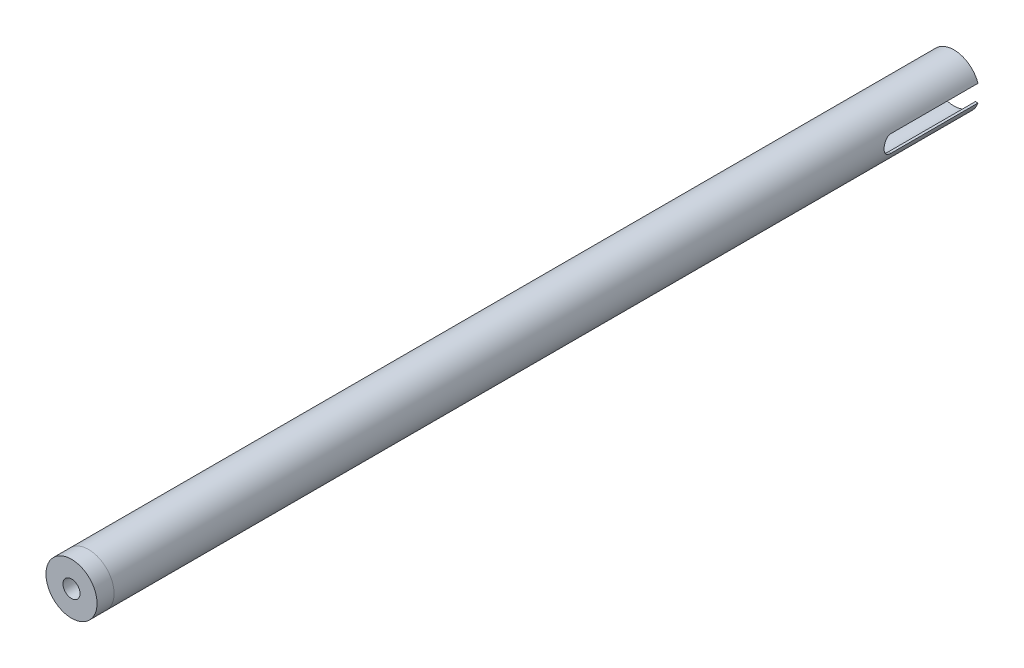
ISO-10303-21;
HEADER;
FILE_DESCRIPTION(('STEP AP214'),'2;1');
FILE_NAME('part.step','',(''),(''),'','','');
FILE_SCHEMA(('AUTOMOTIVE_DESIGN { 1 0 10303 214 1 1 1 1 }'));
ENDSEC;
DATA;
#1=APPLICATION_CONTEXT('core data for automotive mechanical design processes');
#2=APPLICATION_PROTOCOL_DEFINITION('international standard','automotive_design',2000,#1);
#3=PRODUCT_CONTEXT('',#1,'mechanical');
#4=PRODUCT('Part','Part','',(#3));
#5=PRODUCT_RELATED_PRODUCT_CATEGORY('part','',(#4));
#6=PRODUCT_DEFINITION_FORMATION('','',#4);
#7=PRODUCT_DEFINITION_CONTEXT('part definition',#1,'design');
#8=PRODUCT_DEFINITION('design','',#6,#7);
#9=PRODUCT_DEFINITION_SHAPE('','',#8);
#10=(LENGTH_UNIT() NAMED_UNIT(*) SI_UNIT(.MILLI.,.METRE.));
#11=(NAMED_UNIT(*) PLANE_ANGLE_UNIT() SI_UNIT($,.RADIAN.));
#12=(NAMED_UNIT(*) SI_UNIT($,.STERADIAN.) SOLID_ANGLE_UNIT());
#13=UNCERTAINTY_MEASURE_WITH_UNIT(LENGTH_MEASURE(1.E-05),#10,'distance_accuracy_value','');
#14=(GEOMETRIC_REPRESENTATION_CONTEXT(3) GLOBAL_UNCERTAINTY_ASSIGNED_CONTEXT((#13)) GLOBAL_UNIT_ASSIGNED_CONTEXT((#10,
#11,#12)) REPRESENTATION_CONTEXT('',''));
#15=CARTESIAN_POINT('',(0.,0.,0.));
#16=DIRECTION('',(0.,0.,1.));
#17=DIRECTION('',(1.,0.,0.));
#18=AXIS2_PLACEMENT_3D('',#15,#16,#17);
#19=CARTESIAN_POINT('',(0.,0.,-329.057104319801));
#20=DIRECTION('',(0.,0.,1.));
#21=DIRECTION('',(1.,0.,0.));
#22=AXIS2_PLACEMENT_3D('',#19,#20,#21);
#23=CYLINDRICAL_SURFACE('',#22,9.525);
#24=CARTESIAN_POINT('',(0.,0.,-6.35));
#25=DIRECTION('',(0.,0.,1.));
#26=DIRECTION('',(1.,0.,0.));
#27=AXIS2_PLACEMENT_3D('',#24,#25,#26);
#28=CIRCLE('',#27,9.525);
#29=CARTESIAN_POINT('',(9.525,0.,-6.35));
#30=VERTEX_POINT('',#29);
#31=EDGE_CURVE('E165',#30,#30,#28,.T.);
#32=ORIENTED_EDGE('',*,*,#31,.F.);
#33=EDGE_LOOP('',(#32));
#34=FACE_BOUND('',#33,.T.);
#35=CARTESIAN_POINT('',(-8.98025612106915,3.175,-296.672104319801));
#36=CARTESIAN_POINT('',(-8.98024230233901,3.17501142134308,-296.585478216465));
#37=CARTESIAN_POINT('',(-8.98150922759707,3.17145501317748,-296.498859833989));
#38=CARTESIAN_POINT('',(-8.98650170400112,3.1572955094353,-296.326295019163));
#39=CARTESIAN_POINT('',(-8.99022659113085,3.14669431699565,-296.240348411677));
#40=CARTESIAN_POINT('',(-9.00001740508998,3.11857670914846,-296.069994170512));
#41=CARTESIAN_POINT('',(-9.00607621805003,3.10108130380329,-295.985582668705));
#42=CARTESIAN_POINT('',(-9.02033586435303,3.05935434973544,-295.81864786737));
#43=CARTESIAN_POINT('',(-9.02853677497232,3.03512255799513,-295.736124636078));
#44=CARTESIAN_POINT('',(-9.05598792154067,2.95264369348964,-295.492326012802));
#45=CARTESIAN_POINT('',(-9.07810200713863,2.88457148458963,-295.334572428477));
#46=CARTESIAN_POINT('',(-9.12745136023601,2.72437908867645,-295.032695909988));
#47=CARTESIAN_POINT('',(-9.15468995097455,2.63224328129308,-294.88858191276));
#48=CARTESIAN_POINT('',(-9.21240416673121,2.42269155952414,-294.612429052936));
#49=CARTESIAN_POINT('',(-9.24296008478943,2.30449853156512,-294.480995471073));
#50=CARTESIAN_POINT('',(-9.30318902123142,2.04784031127145,-294.239400174736));
#51=CARTESIAN_POINT('',(-9.33286185998227,1.90937102786996,-294.129242763504));
#52=CARTESIAN_POINT('',(-9.38892492365178,1.61159672697579,-293.930525752016));
#53=CARTESIAN_POINT('',(-9.41520772598947,1.45183792838571,-293.842613566006));
#54=CARTESIAN_POINT('',(-9.46054712430069,1.11883883316163,-293.695208839936));
#55=CARTESIAN_POINT('',(-9.47961052807859,0.945611424033776,-293.635689511935));
#56=CARTESIAN_POINT('',(-9.50410661247238,0.642992499572378,-293.560210747439));
#57=CARTESIAN_POINT('',(-9.51189798251809,0.515662964136021,-293.536592775396));
#58=CARTESIAN_POINT('',(-9.51973491912187,0.323120458247706,-293.512926509222));
#59=CARTESIAN_POINT('',(-9.52170555244691,0.258670486244995,-293.506997861606));
#60=CARTESIAN_POINT('',(-9.52433958502699,0.129484930346662,-293.499085236939));
#61=CARTESIAN_POINT('',(-9.5250026318504,0.0647492741617735,-293.497102323375));
#62=CARTESIAN_POINT('',(-9.525,0.,-293.497104319801));
#63=B_SPLINE_CURVE_WITH_KNOTS('',3,(#35,#36,#37,#38,#39,#40,#41,#42,#43,#44,#45,#46,#47,#48,#49,
#50,#51,#52,#53,#54,#55,#56,#57,#58,#59,#60,#61,#62),.UNSPECIFIED.,.F.,.F.,(4,2,2,2,2,2,2,2,2,2,
2,2,2,4),(0.,0.259783027985017,0.519495904525387,0.77842335407941,1.0373601457496,
1.5544837070914,2.07194378605916,2.60765740005749,3.14347925237348,3.69345572792675,
4.24291228331228,4.63105001394513,4.82518498412947,5.01937227204625),.UNSPECIFIED.);
#64=CARTESIAN_POINT('',(-8.98025612106915,3.175,-296.672104319801));
#65=VERTEX_POINT('',#64);
#66=CARTESIAN_POINT('',(-9.525,0.,-293.497104319801));
#67=VERTEX_POINT('',#66);
#68=EDGE_CURVE('E192',#65,#67,#63,.T.);
#69=ORIENTED_EDGE('',*,*,#68,.T.);
#70=CARTESIAN_POINT('',(-9.525,0.,-293.497104319801));
#71=CARTESIAN_POINT('',(-9.52501110102584,-0.0867614879611047,-293.497093214763));
#72=CARTESIAN_POINT('',(-9.52381482114642,-0.173516026970688,-293.50066042642));
#73=CARTESIAN_POINT('',(-9.51909010104991,-0.346361025979108,-293.514865265002));
#74=CARTESIAN_POINT('',(-9.51556219632442,-0.432451633867625,-293.525501268479));
#75=CARTESIAN_POINT('',(-9.50626969526085,-0.603121388983429,-293.553718259993));
#76=CARTESIAN_POINT('',(-9.50051134567603,-0.687704073408636,-293.571279854162));
#77=CARTESIAN_POINT('',(-9.48692170416637,-0.854983898510564,-293.6131711748));
#78=CARTESIAN_POINT('',(-9.47909035815865,-0.937680989932468,-293.63750107785));
#79=CARTESIAN_POINT('',(-9.45278540829331,-1.18202731628102,-293.720335470788));
#80=CARTESIAN_POINT('',(-9.43148823554423,-1.3401498669332,-293.788721152133));
#81=CARTESIAN_POINT('',(-9.38354405256208,-1.64264414222568,-293.949647677909));
#82=CARTESIAN_POINT('',(-9.35689419571071,-1.78700848960572,-294.042201383063));
#83=CARTESIAN_POINT('',(-9.30002401422068,-2.06291632995426,-294.252194811268));
#84=CARTESIAN_POINT('',(-9.26971861159364,-2.19392359690272,-294.370317096687));
#85=CARTESIAN_POINT('',(-9.20941732427213,-2.43468689521897,-294.626655073522));
#86=CARTESIAN_POINT('',(-9.1794215361322,-2.54443647619592,-294.764876841681));
#87=CARTESIAN_POINT('',(-9.122187697517,-2.74268087840456,-295.062384820728));
#88=CARTESIAN_POINT('',(-9.09505529775998,-2.83046425019683,-295.222166958801));
#89=CARTESIAN_POINT('',(-9.04794936227173,-2.97762337182932,-295.555211280807));
#90=CARTESIAN_POINT('',(-9.0279682579705,-3.03702917747986,-295.728458975614));
#91=CARTESIAN_POINT('',(-9.00226999890487,-3.1122125650425,-296.030746009609));
#92=CARTESIAN_POINT('',(-8.99408207355733,-3.13569679171672,-296.157708331036));
#93=CARTESIAN_POINT('',(-8.98304472933549,-3.16711304593222,-296.413785502805));
#94=CARTESIAN_POINT('',(-8.98019613476149,-3.17504267212105,-296.542900682407));
#95=CARTESIAN_POINT('',(-8.98025612106915,-3.175,-296.672104319801));
#96=B_SPLINE_CURVE_WITH_KNOTS('',3,(#70,#71,#72,#73,#74,#75,#76,#77,#78,#79,#80,#81,#82,#83,#84,
#85,#86,#87,#88,#89,#90,#91,#92,#93,#94,#95),.UNSPECIFIED.,.F.,.F.,(4,2,2,2,2,2,2,2,2,2,2,2,4),
(0.,0.260191091827307,0.52032244773723,0.779730467212497,1.03914525511038,1.55731822615721,
2.07576750062865,2.61028978360817,3.14497400776474,3.69521752133766,4.24487695078963,
4.63199348452988,5.01916977744542),.UNSPECIFIED.);
#97=CARTESIAN_POINT('',(-8.98025612106916,-3.175,-296.672104319801));
#98=VERTEX_POINT('',#97);
#99=EDGE_CURVE('E144',#67,#98,#96,.T.);
#100=ORIENTED_EDGE('',*,*,#99,.T.);
#101=DIRECTION('',(0.,0.,-1.));
#102=VECTOR('',#101,1.);
#103=CARTESIAN_POINT('',(-8.98025612106916,-3.175,-293.497104319801));
#104=LINE('',#103,#102);
#105=CARTESIAN_POINT('',(-8.98025612106916,-3.175,-329.057104319801));
#106=VERTEX_POINT('',#105);
#107=EDGE_CURVE('E139',#98,#106,#104,.T.);
#108=ORIENTED_EDGE('',*,*,#107,.T.);
#109=CARTESIAN_POINT('',(0.,0.,-329.057104319801));
#110=DIRECTION('',(0.,0.,1.));
#111=DIRECTION('',(1.,0.,0.));
#112=AXIS2_PLACEMENT_3D('',#109,#110,#111);
#113=CIRCLE('',#112,9.525);
#114=CARTESIAN_POINT('',(8.98025612106915,-3.175,-329.057104319801));
#115=VERTEX_POINT('',#114);
#116=EDGE_CURVE('E142',#106,#115,#113,.T.);
#117=ORIENTED_EDGE('',*,*,#116,.T.);
#118=DIRECTION('',(0.,0.,-1.));
#119=VECTOR('',#118,1.);
#120=CARTESIAN_POINT('',(8.98025612106915,-3.175,-293.497104319801));
#121=LINE('',#120,#119);
#122=CARTESIAN_POINT('',(8.98025612106915,-3.175,-296.672104319801));
#123=VERTEX_POINT('',#122);
#124=EDGE_CURVE('E425',#123,#115,#121,.T.);
#125=ORIENTED_EDGE('',*,*,#124,.F.);
#126=CARTESIAN_POINT('',(8.98025612106915,-3.175,-296.672104319801));
#127=CARTESIAN_POINT('',(8.98024230233901,-3.17501142134308,-296.585478216465));
#128=CARTESIAN_POINT('',(8.98150922759707,-3.17145501317748,-296.498859833989));
#129=CARTESIAN_POINT('',(8.98650170400112,-3.1572955094353,-296.326295019163));
#130=CARTESIAN_POINT('',(8.99022659113085,-3.14669431699565,-296.240348411677));
#131=CARTESIAN_POINT('',(9.00001740508998,-3.11857670914846,-296.069994170512));
#132=CARTESIAN_POINT('',(9.00607621805003,-3.10108130380329,-295.985582668705));
#133=CARTESIAN_POINT('',(9.02033586435303,-3.05935434973544,-295.81864786737));
#134=CARTESIAN_POINT('',(9.02853677497232,-3.03512255799513,-295.736124636078));
#135=CARTESIAN_POINT('',(9.05598792154067,-2.95264369348964,-295.492326012802));
#136=CARTESIAN_POINT('',(9.07810200713863,-2.88457148458963,-295.334572428477));
#137=CARTESIAN_POINT('',(9.12745136023601,-2.72437908867645,-295.032695909988));
#138=CARTESIAN_POINT('',(9.15468995097455,-2.63224328129308,-294.88858191276));
#139=CARTESIAN_POINT('',(9.21240416673121,-2.42269155952414,-294.612429052936));
#140=CARTESIAN_POINT('',(9.24296008478943,-2.30449853156512,-294.480995471073));
#141=CARTESIAN_POINT('',(9.30318902123142,-2.04784031127145,-294.239400174736));
#142=CARTESIAN_POINT('',(9.33286185998227,-1.90937102786996,-294.129242763504));
#143=CARTESIAN_POINT('',(9.38892492365178,-1.61159672697579,-293.930525752016));
#144=CARTESIAN_POINT('',(9.41520772598947,-1.45183792838571,-293.842613566006));
#145=CARTESIAN_POINT('',(9.46054712430069,-1.11883883316163,-293.695208839936));
#146=CARTESIAN_POINT('',(9.47961052807859,-0.945611424033776,-293.635689511935));
#147=CARTESIAN_POINT('',(9.50410661247238,-0.642992499572378,-293.560210747439));
#148=CARTESIAN_POINT('',(9.51189798251809,-0.515662964136021,-293.536592775396));
#149=CARTESIAN_POINT('',(9.51973491912187,-0.323120458247706,-293.512926509222));
#150=CARTESIAN_POINT('',(9.52170555244691,-0.258670486244995,-293.506997861606));
#151=CARTESIAN_POINT('',(9.52433958502699,-0.129484930346662,-293.499085236939));
#152=CARTESIAN_POINT('',(9.5250026318504,-0.0647492741617735,-293.497102323375));
#153=CARTESIAN_POINT('',(9.525,0.,-293.497104319801));
#154=B_SPLINE_CURVE_WITH_KNOTS('',3,(#126,#127,#128,#129,#130,#131,#132,#133,#134,#135,#136,
#137,#138,#139,#140,#141,#142,#143,#144,#145,#146,#147,#148,#149,#150,#151,#152,#153),
.UNSPECIFIED.,.F.,.F.,(4,2,2,2,2,2,2,2,2,2,2,2,2,4),(0.,0.259783027985017,0.519495904525387,
0.77842335407941,1.0373601457496,1.5544837070914,2.07194378605916,2.60765740005749,
3.14347925237348,3.69345572792675,4.24291228331228,4.63105001394513,4.82518498412947,
5.01937227204625),.UNSPECIFIED.);
#155=CARTESIAN_POINT('',(9.525,0.,-293.497104319801));
#156=VERTEX_POINT('',#155);
#157=EDGE_CURVE('E85',#123,#156,#154,.T.);
#158=ORIENTED_EDGE('',*,*,#157,.T.);
#159=CARTESIAN_POINT('',(9.525,0.,-293.497104319801));
#160=CARTESIAN_POINT('',(9.52501110102584,0.0867614879611047,-293.497093214763));
#161=CARTESIAN_POINT('',(9.52381482114642,0.173516026970688,-293.50066042642));
#162=CARTESIAN_POINT('',(9.51909010104991,0.346361025979108,-293.514865265002));
#163=CARTESIAN_POINT('',(9.51556219632442,0.432451633867625,-293.525501268479));
#164=CARTESIAN_POINT('',(9.50626969526085,0.603121388983429,-293.553718259993));
#165=CARTESIAN_POINT('',(9.50051134567603,0.687704073408636,-293.571279854162));
#166=CARTESIAN_POINT('',(9.48692170416637,0.854983898510564,-293.6131711748));
#167=CARTESIAN_POINT('',(9.47909035815865,0.937680989932468,-293.63750107785));
#168=CARTESIAN_POINT('',(9.45278540829331,1.18202731628102,-293.720335470788));
#169=CARTESIAN_POINT('',(9.43148823554423,1.3401498669332,-293.788721152133));
#170=CARTESIAN_POINT('',(9.38354405256208,1.64264414222568,-293.949647677909));
#171=CARTESIAN_POINT('',(9.35689419571071,1.78700848960572,-294.042201383063));
#172=CARTESIAN_POINT('',(9.30002401422068,2.06291632995426,-294.252194811268));
#173=CARTESIAN_POINT('',(9.26971861159364,2.19392359690272,-294.370317096687));
#174=CARTESIAN_POINT('',(9.20941732427213,2.43468689521897,-294.626655073522));
#175=CARTESIAN_POINT('',(9.1794215361322,2.54443647619592,-294.764876841681));
#176=CARTESIAN_POINT('',(9.122187697517,2.74268087840456,-295.062384820728));
#177=CARTESIAN_POINT('',(9.09505529775998,2.83046425019683,-295.222166958801));
#178=CARTESIAN_POINT('',(9.04794936227173,2.97762337182932,-295.555211280807));
#179=CARTESIAN_POINT('',(9.0279682579705,3.03702917747986,-295.728458975614));
#180=CARTESIAN_POINT('',(9.00226999890487,3.1122125650425,-296.030746009609));
#181=CARTESIAN_POINT('',(8.99408207355733,3.13569679171672,-296.157708331036));
#182=CARTESIAN_POINT('',(8.98304472933549,3.16711304593222,-296.413785502805));
#183=CARTESIAN_POINT('',(8.98019613476149,3.17504267212105,-296.542900682407));
#184=CARTESIAN_POINT('',(8.98025612106915,3.175,-296.672104319801));
#185=B_SPLINE_CURVE_WITH_KNOTS('',3,(#159,#160,#161,#162,#163,#164,#165,#166,#167,#168,#169,
#170,#171,#172,#173,#174,#175,#176,#177,#178,#179,#180,#181,#182,#183,#184),.UNSPECIFIED.,.F.,
.F.,(4,2,2,2,2,2,2,2,2,2,2,2,4),(0.,0.260191091827307,0.52032244773723,0.779730467212497,
1.03914525511038,1.55731822615721,2.07576750062865,2.61028978360817,3.14497400776474,
3.69521752133766,4.24487695078963,4.63199348452988,5.01916977744542),.UNSPECIFIED.);
#186=CARTESIAN_POINT('',(8.98025612106915,3.175,-296.672104319801));
#187=VERTEX_POINT('',#186);
#188=EDGE_CURVE('E71',#156,#187,#185,.T.);
#189=ORIENTED_EDGE('',*,*,#188,.T.);
#190=DIRECTION('',(0.,0.,-1.));
#191=VECTOR('',#190,1.);
#192=CARTESIAN_POINT('',(8.98025612106915,3.175,-293.497104319801));
#193=LINE('',#192,#191);
#194=CARTESIAN_POINT('',(8.98025612106915,3.175,-329.057104319801));
#195=VERTEX_POINT('',#194);
#196=EDGE_CURVE('E158',#187,#195,#193,.T.);
#197=ORIENTED_EDGE('',*,*,#196,.T.);
#198=CARTESIAN_POINT('',(-8.98025612106915,3.175,-329.057104319801));
#199=VERTEX_POINT('',#198);
#200=EDGE_CURVE('E164',#195,#199,#113,.T.);
#201=ORIENTED_EDGE('',*,*,#200,.T.);
#202=DIRECTION('',(0.,0.,-1.));
#203=VECTOR('',#202,1.);
#204=CARTESIAN_POINT('',(-8.98025612106915,3.175,-293.497104319801));
#205=LINE('',#204,#203);
#206=EDGE_CURVE('E418',#65,#199,#205,.T.);
#207=ORIENTED_EDGE('',*,*,#206,.F.);
#208=EDGE_LOOP('',(#69,#100,#108,#117,#125,#158,#189,#197,#201,#207));
#209=FACE_BOUND('',#208,.T.);
#210=ADVANCED_FACE('F61',(#34,#209),#23,.T.);
#211=CARTESIAN_POINT('',(0.,0.,-329.057104319801));
#212=DIRECTION('',(0.,0.,1.));
#213=DIRECTION('',(1.,0.,0.));
#214=AXIS2_PLACEMENT_3D('',#211,#212,#213);
#215=PLANE('',#214);
#216=DIRECTION('',(1.,0.,0.));
#217=VECTOR('',#216,1.);
#218=CARTESIAN_POINT('',(0.,-3.175,-329.057104319801));
#219=LINE('',#218,#217);
#220=CARTESIAN_POINT('',(-8.03118117091129,-3.175,-329.057104319801));
#221=VERTEX_POINT('',#220);
#222=EDGE_CURVE('E151',#106,#221,#219,.T.);
#223=ORIENTED_EDGE('',*,*,#222,.T.);
#224=CARTESIAN_POINT('',(0.,0.,-329.057104319801));
#225=DIRECTION('',(0.,0.,1.));
#226=DIRECTION('',(1.,0.,0.));
#227=AXIS2_PLACEMENT_3D('',#224,#225,#226);
#228=CIRCLE('',#227,8.636);
#229=CARTESIAN_POINT('',(8.03118117091129,-3.175,-329.057104319801));
#230=VERTEX_POINT('',#229);
#231=EDGE_CURVE('E273',#221,#230,#228,.T.);
#232=ORIENTED_EDGE('',*,*,#231,.T.);
#233=DIRECTION('',(1.,0.,0.));
#234=VECTOR('',#233,1.);
#235=CARTESIAN_POINT('',(0.,-3.175,-329.057104319801));
#236=LINE('',#235,#234);
#237=EDGE_CURVE('E163',#230,#115,#236,.T.);
#238=ORIENTED_EDGE('',*,*,#237,.T.);
#239=ORIENTED_EDGE('',*,*,#116,.F.);
#240=EDGE_LOOP('',(#223,#232,#238,#239));
#241=FACE_BOUND('',#240,.T.);
#242=ADVANCED_FACE('F161',(#241),#215,.F.);
#243=CARTESIAN_POINT('',(0.,0.,-329.057104319801));
#244=DIRECTION('',(0.,0.,1.));
#245=DIRECTION('',(1.,0.,0.));
#246=AXIS2_PLACEMENT_3D('',#243,#244,#245);
#247=CYLINDRICAL_SURFACE('',#246,8.636);
#248=CARTESIAN_POINT('',(0.,0.,-6.35));
#249=DIRECTION('',(0.,0.,1.));
#250=DIRECTION('',(1.,0.,0.));
#251=AXIS2_PLACEMENT_3D('',#248,#249,#250);
#252=CIRCLE('',#251,8.636);
#253=CARTESIAN_POINT('',(8.636,0.,-6.35));
#254=VERTEX_POINT('',#253);
#255=EDGE_CURVE('E147',#254,#254,#252,.T.);
#256=ORIENTED_EDGE('',*,*,#255,.T.);
#257=EDGE_LOOP('',(#256));
#258=FACE_BOUND('',#257,.T.);
#259=DIRECTION('',(0.,0.,-1.));
#260=VECTOR('',#259,1.);
#261=CARTESIAN_POINT('',(-8.03118117091129,-3.175,-293.497104319801));
#262=LINE('',#261,#260);
#263=CARTESIAN_POINT('',(-8.03118117091129,-3.175,-296.672104319801));
#264=VERTEX_POINT('',#263);
#265=EDGE_CURVE('E148',#264,#221,#262,.T.);
#266=ORIENTED_EDGE('',*,*,#265,.F.);
#267=CARTESIAN_POINT('',(-8.03118117091129,-3.175,-296.672104319801));
#268=CARTESIAN_POINT('',(-8.03116550357192,-3.17501203663229,-296.586069351685));
#269=CARTESIAN_POINT('',(-8.03256328665432,-3.17150327993899,-296.500042999156));
#270=CARTESIAN_POINT('',(-8.03806891362409,-3.15753809299539,-296.328670428687));
#271=CARTESIAN_POINT('',(-8.04217588089716,-3.14708391007799,-296.24332399978));
#272=CARTESIAN_POINT('',(-8.05296421917626,-3.11937037021479,-296.074214865565));
#273=CARTESIAN_POINT('',(-8.05963650808001,-3.10213501593152,-295.990447654623));
#274=CARTESIAN_POINT('',(-8.07533202922414,-3.06104389654164,-295.824798691855));
#275=CARTESIAN_POINT('',(-8.08435537430867,-3.0371878136549,-295.742917030735));
#276=CARTESIAN_POINT('',(-8.11453837074661,-2.95603278100127,-295.50106487349));
#277=CARTESIAN_POINT('',(-8.13883087950844,-2.88909903597752,-295.344598235915));
#278=CARTESIAN_POINT('',(-8.19300406693486,-2.73167948818753,-295.04506324679));
#279=CARTESIAN_POINT('',(-8.22288931448619,-2.64117440539563,-294.902005994233));
#280=CARTESIAN_POINT('',(-8.28646461334555,-2.43457537576577,-294.626535584995));
#281=CARTESIAN_POINT('',(-8.32026315150128,-2.31754645569601,-294.494847212909));
#282=CARTESIAN_POINT('',(-8.38695072719909,-2.06320558041455,-294.252459034515));
#283=CARTESIAN_POINT('',(-8.41983956911545,-1.9258893021522,-294.141763713145));
#284=CARTESIAN_POINT('',(-8.48230406273647,-1.62932475427476,-293.940982598194));
#285=CARTESIAN_POINT('',(-8.5117351959247,-1.46950375402868,-293.851694244689));
#286=CARTESIAN_POINT('',(-8.56262575627031,-1.13591027783606,-293.701632091725));
#287=CARTESIAN_POINT('',(-8.58409342507971,-0.962152453429211,-293.640828794905));
#288=CARTESIAN_POINT('',(-8.61197450421745,-0.656412542712577,-293.562904429256));
#289=CARTESIAN_POINT('',(-8.62092967235125,-0.526538210349248,-293.538288644917));
#290=CARTESIAN_POINT('',(-8.62994176115801,-0.330020976938503,-293.513611313201));
#291=CARTESIAN_POINT('',(-8.63220903333296,-0.264206342476349,-293.507426574051));
#292=CARTESIAN_POINT('',(-8.63523992352765,-0.132266265743974,-293.499171358606));
#293=CARTESIAN_POINT('',(-8.6360031097792,-0.066140739687068,-293.497102063703));
#294=CARTESIAN_POINT('',(-8.636,0.,-293.497104319801));
#295=B_SPLINE_CURVE_WITH_KNOTS('',3,(#267,#268,#269,#270,#271,#272,#273,#274,#275,#276,#277,
#278,#279,#280,#281,#282,#283,#284,#285,#286,#287,#288,#289,#290,#291,#292,#293,#294),
.UNSPECIFIED.,.F.,.F.,(4,2,2,2,2,2,2,2,2,2,2,2,2,4),(0.,0.258007583993685,0.515931725057005,
0.77295101340558,1.02998264023838,1.54317615093284,2.05679075055082,2.59254838663377,
3.128420352877,3.68191422398171,4.23483365719865,4.63113823379684,4.82943692106889,
5.02779252437178),.UNSPECIFIED.);
#296=CARTESIAN_POINT('',(-8.636,0.,-293.497104319801));
#297=VERTEX_POINT('',#296);
#298=EDGE_CURVE('E219',#264,#297,#295,.T.);
#299=ORIENTED_EDGE('',*,*,#298,.T.);
#300=CARTESIAN_POINT('',(-8.636,0.,-293.497104319801));
#301=CARTESIAN_POINT('',(-8.63601200177566,0.0862340545028674,-293.497092746077));
#302=CARTESIAN_POINT('',(-8.63470866649585,0.172460638964019,-293.500617286098));
#303=CARTESIAN_POINT('',(-8.62956076290727,0.344245368623967,-293.514648715727));
#304=CARTESIAN_POINT('',(-8.62571686385256,0.429803683858979,-293.525153766483));
#305=CARTESIAN_POINT('',(-8.61559314175803,0.599377201936831,-293.553012520539));
#306=CARTESIAN_POINT('',(-8.60932102288695,0.683396413719323,-293.570344566395));
#307=CARTESIAN_POINT('',(-8.5945171663722,0.849553539449472,-293.61167578967));
#308=CARTESIAN_POINT('',(-8.58598535382315,0.931691390934832,-293.635675188103));
#309=CARTESIAN_POINT('',(-8.55732464851214,1.17435074221828,-293.717349369541));
#310=CARTESIAN_POINT('',(-8.53411500636261,1.33136171263576,-293.784740690507));
#311=CARTESIAN_POINT('',(-8.48180653117632,1.63181198358794,-293.943232400517));
#312=CARTESIAN_POINT('',(-8.45270389942466,1.77524244193608,-294.034348093554));
#313=CARTESIAN_POINT('',(-8.39029834803106,2.05036661398532,-294.241601211233));
#314=CARTESIAN_POINT('',(-8.35688032192871,2.1814347411356,-294.358535578825));
#315=CARTESIAN_POINT('',(-8.29018507770489,2.42260670191496,-294.612424565281));
#316=CARTESIAN_POINT('',(-8.25690791509208,2.53270290926749,-294.749386435111));
#317=CARTESIAN_POINT('',(-8.19291826363247,2.73277128594141,-295.045551523936));
#318=CARTESIAN_POINT('',(-8.16234475412034,2.82185641770732,-295.205386613373));
#319=CARTESIAN_POINT('',(-8.10906121054024,2.97153048258984,-295.538981956875));
#320=CARTESIAN_POINT('',(-8.08634169503735,3.03215380703845,-295.712725106544));
#321=CARTESIAN_POINT('',(-8.05677760160867,3.10966172606007,-296.017993741357));
#322=CARTESIAN_POINT('',(-8.04725077861386,3.13409804308654,-296.147374460563));
#323=CARTESIAN_POINT('',(-8.03764862425496,3.15860280233701,-296.343181586404));
#324=CARTESIAN_POINT('',(-8.0352292163598,3.16474613160121,-296.408774342709));
#325=CARTESIAN_POINT('',(-8.03199317651195,3.17294655384153,-296.540274295099));
#326=CARTESIAN_POINT('',(-8.03117703985816,3.17500238406813,-296.60618158205));
#327=CARTESIAN_POINT('',(-8.03118117091129,3.175,-296.672104319801));
#328=B_SPLINE_CURVE_WITH_KNOTS('',3,(#300,#301,#302,#303,#304,#305,#306,#307,#308,#309,#310,
#311,#312,#313,#314,#315,#316,#317,#318,#319,#320,#321,#322,#323,#324,#325,#326,#327),
.UNSPECIFIED.,.F.,.F.,(4,2,2,2,2,2,2,2,2,2,2,2,2,4),(0.,0.258607684277243,0.517147271349152,
0.774873208333408,1.03260768960759,1.54734347080466,2.06241212125685,2.59642224394461,
3.13062618611954,3.6844391606936,4.23758121159796,4.63245186558856,4.83009172977022,
5.0277926412787),.UNSPECIFIED.);
#329=CARTESIAN_POINT('',(-8.03118117091129,3.175,-296.672104319801));
#330=VERTEX_POINT('',#329);
#331=EDGE_CURVE('E184',#297,#330,#328,.T.);
#332=ORIENTED_EDGE('',*,*,#331,.T.);
#333=DIRECTION('',(0.,0.,-1.));
#334=VECTOR('',#333,1.);
#335=CARTESIAN_POINT('',(-8.03118117091129,3.175,-293.497104319801));
#336=LINE('',#335,#334);
#337=CARTESIAN_POINT('',(-8.03118117091129,3.175,-329.057104319801));
#338=VERTEX_POINT('',#337);
#339=EDGE_CURVE('E415',#330,#338,#336,.T.);
#340=ORIENTED_EDGE('',*,*,#339,.T.);
#341=CARTESIAN_POINT('',(8.03118117091129,3.175,-329.057104319801));
#342=VERTEX_POINT('',#341);
#343=EDGE_CURVE('E170',#342,#338,#228,.T.);
#344=ORIENTED_EDGE('',*,*,#343,.F.);
#345=DIRECTION('',(0.,0.,-1.));
#346=VECTOR('',#345,1.);
#347=CARTESIAN_POINT('',(8.03118117091129,3.175,-293.497104319801));
#348=LINE('',#347,#346);
#349=CARTESIAN_POINT('',(8.03118117091129,3.175,-296.672104319801));
#350=VERTEX_POINT('',#349);
#351=EDGE_CURVE('E267',#350,#342,#348,.T.);
#352=ORIENTED_EDGE('',*,*,#351,.F.);
#353=CARTESIAN_POINT('',(8.03118117091129,3.175,-296.672104319801));
#354=CARTESIAN_POINT('',(8.03116550357192,3.17501203663229,-296.586069351685));
#355=CARTESIAN_POINT('',(8.03256328665432,3.17150327993899,-296.500042999156));
#356=CARTESIAN_POINT('',(8.03806891362409,3.15753809299539,-296.328670428687));
#357=CARTESIAN_POINT('',(8.04217588089716,3.14708391007799,-296.24332399978));
#358=CARTESIAN_POINT('',(8.05296421917626,3.11937037021479,-296.074214865565));
#359=CARTESIAN_POINT('',(8.05963650808001,3.10213501593152,-295.990447654623));
#360=CARTESIAN_POINT('',(8.07533202922414,3.06104389654164,-295.824798691855));
#361=CARTESIAN_POINT('',(8.08435537430867,3.0371878136549,-295.742917030735));
#362=CARTESIAN_POINT('',(8.11453837074661,2.95603278100127,-295.50106487349));
#363=CARTESIAN_POINT('',(8.13883087950844,2.88909903597752,-295.344598235915));
#364=CARTESIAN_POINT('',(8.19300406693486,2.73167948818753,-295.04506324679));
#365=CARTESIAN_POINT('',(8.22288931448619,2.64117440539563,-294.902005994233));
#366=CARTESIAN_POINT('',(8.28646461334555,2.43457537576577,-294.626535584995));
#367=CARTESIAN_POINT('',(8.32026315150128,2.31754645569601,-294.494847212909));
#368=CARTESIAN_POINT('',(8.38695072719909,2.06320558041455,-294.252459034515));
#369=CARTESIAN_POINT('',(8.41983956911545,1.9258893021522,-294.141763713145));
#370=CARTESIAN_POINT('',(8.48230406273647,1.62932475427476,-293.940982598194));
#371=CARTESIAN_POINT('',(8.5117351959247,1.46950375402868,-293.851694244689));
#372=CARTESIAN_POINT('',(8.56262575627031,1.13591027783606,-293.701632091725));
#373=CARTESIAN_POINT('',(8.58409342507971,0.962152453429211,-293.640828794905));
#374=CARTESIAN_POINT('',(8.61197450421745,0.656412542712577,-293.562904429256));
#375=CARTESIAN_POINT('',(8.62092967235125,0.526538210349248,-293.538288644917));
#376=CARTESIAN_POINT('',(8.62994176115801,0.330020976938503,-293.513611313201));
#377=CARTESIAN_POINT('',(8.63220903333296,0.264206342476349,-293.507426574051));
#378=CARTESIAN_POINT('',(8.63523992352765,0.132266265743974,-293.499171358606));
#379=CARTESIAN_POINT('',(8.6360031097792,0.066140739687068,-293.497102063703));
#380=CARTESIAN_POINT('',(8.636,0.,-293.497104319801));
#381=B_SPLINE_CURVE_WITH_KNOTS('',3,(#353,#354,#355,#356,#357,#358,#359,#360,#361,#362,#363,
#364,#365,#366,#367,#368,#369,#370,#371,#372,#373,#374,#375,#376,#377,#378,#379,#380),
.UNSPECIFIED.,.F.,.F.,(4,2,2,2,2,2,2,2,2,2,2,2,2,4),(0.,0.258007583993685,0.515931725057005,
0.77295101340558,1.02998264023838,1.54317615093284,2.05679075055082,2.59254838663377,
3.128420352877,3.68191422398171,4.23483365719865,4.63113823379684,4.82943692106889,
5.02779252437178),.UNSPECIFIED.);
#382=CARTESIAN_POINT('',(8.636,0.,-293.497104319801));
#383=VERTEX_POINT('',#382);
#384=EDGE_CURVE('E13',#350,#383,#381,.T.);
#385=ORIENTED_EDGE('',*,*,#384,.T.);
#386=CARTESIAN_POINT('',(8.636,0.,-293.497104319801));
#387=CARTESIAN_POINT('',(8.63601200177566,-0.0862340545028674,-293.497092746077));
#388=CARTESIAN_POINT('',(8.63470866649585,-0.172460638964019,-293.500617286098));
#389=CARTESIAN_POINT('',(8.62956076290727,-0.344245368623967,-293.514648715727));
#390=CARTESIAN_POINT('',(8.62571686385256,-0.429803683858979,-293.525153766483));
#391=CARTESIAN_POINT('',(8.61559314175803,-0.599377201936831,-293.553012520539));
#392=CARTESIAN_POINT('',(8.60932102288695,-0.683396413719323,-293.570344566395));
#393=CARTESIAN_POINT('',(8.5945171663722,-0.849553539449472,-293.61167578967));
#394=CARTESIAN_POINT('',(8.58598535382315,-0.931691390934832,-293.635675188103));
#395=CARTESIAN_POINT('',(8.55732464851214,-1.17435074221828,-293.717349369541));
#396=CARTESIAN_POINT('',(8.53411500636261,-1.33136171263576,-293.784740690507));
#397=CARTESIAN_POINT('',(8.48180653117632,-1.63181198358794,-293.943232400517));
#398=CARTESIAN_POINT('',(8.45270389942466,-1.77524244193608,-294.034348093554));
#399=CARTESIAN_POINT('',(8.39029834803106,-2.05036661398532,-294.241601211233));
#400=CARTESIAN_POINT('',(8.35688032192871,-2.1814347411356,-294.358535578825));
#401=CARTESIAN_POINT('',(8.29018507770489,-2.42260670191496,-294.612424565281));
#402=CARTESIAN_POINT('',(8.25690791509208,-2.53270290926749,-294.749386435111));
#403=CARTESIAN_POINT('',(8.19291826363247,-2.73277128594141,-295.045551523936));
#404=CARTESIAN_POINT('',(8.16234475412034,-2.82185641770732,-295.205386613373));
#405=CARTESIAN_POINT('',(8.10906121054024,-2.97153048258984,-295.538981956875));
#406=CARTESIAN_POINT('',(8.08634169503735,-3.03215380703845,-295.712725106544));
#407=CARTESIAN_POINT('',(8.05677760160867,-3.10966172606007,-296.017993741357));
#408=CARTESIAN_POINT('',(8.04725077861386,-3.13409804308654,-296.147374460563));
#409=CARTESIAN_POINT('',(8.03764862425496,-3.15860280233701,-296.343181586404));
#410=CARTESIAN_POINT('',(8.0352292163598,-3.16474613160121,-296.408774342709));
#411=CARTESIAN_POINT('',(8.03199317651195,-3.17294655384153,-296.540274295099));
#412=CARTESIAN_POINT('',(8.03117703985816,-3.17500238406813,-296.60618158205));
#413=CARTESIAN_POINT('',(8.03118117091129,-3.175,-296.672104319801));
#414=B_SPLINE_CURVE_WITH_KNOTS('',3,(#386,#387,#388,#389,#390,#391,#392,#393,#394,#395,#396,
#397,#398,#399,#400,#401,#402,#403,#404,#405,#406,#407,#408,#409,#410,#411,#412,#413),
.UNSPECIFIED.,.F.,.F.,(4,2,2,2,2,2,2,2,2,2,2,2,2,4),(0.,0.258607684277243,0.517147271349152,
0.774873208333408,1.03260768960759,1.54734347080466,2.06241212125685,2.59642224394461,
3.13062618611954,3.6844391606936,4.23758121159796,4.63245186558856,4.83009172977022,
5.0277926412787),.UNSPECIFIED.);
#415=CARTESIAN_POINT('',(8.03118117091129,-3.175,-296.672104319801));
#416=VERTEX_POINT('',#415);
#417=EDGE_CURVE('E235',#383,#416,#414,.T.);
#418=ORIENTED_EDGE('',*,*,#417,.T.);
#419=DIRECTION('',(0.,0.,-1.));
#420=VECTOR('',#419,1.);
#421=CARTESIAN_POINT('',(8.03118117091129,-3.175,-293.497104319801));
#422=LINE('',#421,#420);
#423=EDGE_CURVE('E269',#416,#230,#422,.T.);
#424=ORIENTED_EDGE('',*,*,#423,.T.);
#425=ORIENTED_EDGE('',*,*,#231,.F.);
#426=EDGE_LOOP('',(#266,#299,#332,#340,#344,#352,#385,#418,#424,#425));
#427=FACE_BOUND('',#426,.T.);
#428=ADVANCED_FACE('F199',(#258,#427),#247,.F.);
#429=ORIENTED_EDGE('',*,*,#343,.T.);
#430=DIRECTION('',(1.,0.,0.));
#431=VECTOR('',#430,1.);
#432=CARTESIAN_POINT('',(0.,3.175,-329.057104319801));
#433=LINE('',#432,#431);
#434=EDGE_CURVE('E157',#199,#338,#433,.T.);
#435=ORIENTED_EDGE('',*,*,#434,.F.);
#436=ORIENTED_EDGE('',*,*,#200,.F.);
#437=DIRECTION('',(1.,0.,0.));
#438=VECTOR('',#437,1.);
#439=CARTESIAN_POINT('',(0.,3.175,-329.057104319801));
#440=LINE('',#439,#438);
#441=EDGE_CURVE('E251',#342,#195,#440,.T.);
#442=ORIENTED_EDGE('',*,*,#441,.F.);
#443=EDGE_LOOP('',(#429,#435,#436,#442));
#444=FACE_BOUND('',#443,.T.);
#445=ADVANCED_FACE('F284',(#444),#215,.F.);
#446=CARTESIAN_POINT('',(0.,0.,-6.35));
#447=DIRECTION('',(0.,0.,1.));
#448=DIRECTION('',(1.,0.,0.));
#449=AXIS2_PLACEMENT_3D('',#446,#447,#448);
#450=PLANE('',#449);
#451=ORIENTED_EDGE('',*,*,#255,.F.);
#452=EDGE_LOOP('',(#451));
#453=FACE_BOUND('',#452,.T.);
#454=ORIENTED_EDGE('',*,*,#31,.T.);
#455=EDGE_LOOP('',(#454));
#456=FACE_BOUND('',#455,.T.);
#457=ADVANCED_FACE('F281',(#453,#456),#450,.T.);
#458=CARTESIAN_POINT('',(0.,3.175,-293.497104319801));
#459=DIRECTION('',(0.,1.,0.));
#460=DIRECTION('',(0.,0.,1.));
#461=AXIS2_PLACEMENT_3D('',#458,#459,#460);
#462=PLANE('',#461);
#463=ORIENTED_EDGE('',*,*,#196,.F.);
#464=DIRECTION('',(1.,0.,0.));
#465=VECTOR('',#464,1.);
#466=CARTESIAN_POINT('',(8.03118117091129,3.175,-296.672104319801));
#467=LINE('',#466,#465);
#468=EDGE_CURVE('E182',#187,#350,#467,.F.);
#469=ORIENTED_EDGE('',*,*,#468,.T.);
#470=ORIENTED_EDGE('',*,*,#351,.T.);
#471=ORIENTED_EDGE('',*,*,#441,.T.);
#472=EDGE_LOOP('',(#463,#469,#470,#471));
#473=FACE_BOUND('',#472,.T.);
#474=ADVANCED_FACE('F264',(#473),#462,.F.);
#475=CARTESIAN_POINT('',(0.,-3.175,-293.497104319801));
#476=DIRECTION('',(0.,1.,0.));
#477=DIRECTION('',(0.,0.,1.));
#478=AXIS2_PLACEMENT_3D('',#475,#476,#477);
#479=PLANE('',#478);
#480=ORIENTED_EDGE('',*,*,#423,.F.);
#481=DIRECTION('',(1.,0.,0.));
#482=VECTOR('',#481,1.);
#483=CARTESIAN_POINT('',(0.,-3.175,-296.672104319801));
#484=LINE('',#483,#482);
#485=EDGE_CURVE('E179',#416,#123,#484,.T.);
#486=ORIENTED_EDGE('',*,*,#485,.T.);
#487=ORIENTED_EDGE('',*,*,#124,.T.);
#488=ORIENTED_EDGE('',*,*,#237,.F.);
#489=EDGE_LOOP('',(#480,#486,#487,#488));
#490=FACE_BOUND('',#489,.T.);
#491=ADVANCED_FACE('F359',(#490),#479,.T.);
#492=CARTESIAN_POINT('',(0.,-3.175,-293.497104319801));
#493=DIRECTION('',(0.,1.,0.));
#494=DIRECTION('',(0.,0.,1.));
#495=AXIS2_PLACEMENT_3D('',#492,#493,#494);
#496=PLANE('',#495);
#497=ORIENTED_EDGE('',*,*,#107,.F.);
#498=DIRECTION('',(1.,0.,0.));
#499=VECTOR('',#498,1.);
#500=CARTESIAN_POINT('',(0.,-3.175,-296.672104319801));
#501=LINE('',#500,#499);
#502=EDGE_CURVE('E177',#98,#264,#501,.T.);
#503=ORIENTED_EDGE('',*,*,#502,.T.);
#504=ORIENTED_EDGE('',*,*,#265,.T.);
#505=ORIENTED_EDGE('',*,*,#222,.F.);
#506=EDGE_LOOP('',(#497,#503,#504,#505));
#507=FACE_BOUND('',#506,.T.);
#508=ADVANCED_FACE('F152',(#507),#496,.T.);
#509=CARTESIAN_POINT('',(0.,3.175,-293.497104319801));
#510=DIRECTION('',(0.,1.,0.));
#511=DIRECTION('',(0.,0.,1.));
#512=AXIS2_PLACEMENT_3D('',#509,#510,#511);
#513=PLANE('',#512);
#514=ORIENTED_EDGE('',*,*,#339,.F.);
#515=DIRECTION('',(1.,0.,0.));
#516=VECTOR('',#515,1.);
#517=CARTESIAN_POINT('',(-8.98025612106915,3.175,-296.672104319801));
#518=LINE('',#517,#516);
#519=EDGE_CURVE('E168',#330,#65,#518,.F.);
#520=ORIENTED_EDGE('',*,*,#519,.T.);
#521=ORIENTED_EDGE('',*,*,#206,.T.);
#522=ORIENTED_EDGE('',*,*,#434,.T.);
#523=EDGE_LOOP('',(#514,#520,#521,#522));
#524=FACE_BOUND('',#523,.T.);
#525=ADVANCED_FACE('F214',(#524),#513,.F.);
#526=CARTESIAN_POINT('',(0.,0.,-296.672104319801));
#527=DIRECTION('',(1.,0.,0.));
#528=DIRECTION('',(0.,0.,-1.));
#529=AXIS2_PLACEMENT_3D('',#526,#527,#528);
#530=CYLINDRICAL_SURFACE('',#529,3.175);
#531=ORIENTED_EDGE('',*,*,#502,.F.);
#532=ORIENTED_EDGE('',*,*,#99,.F.);
#533=DIRECTION('',(1.,0.,0.));
#534=VECTOR('',#533,1.);
#535=CARTESIAN_POINT('',(0.,0.,-293.497104319801));
#536=LINE('',#535,#534);
#537=EDGE_CURVE('E249',#297,#67,#536,.F.);
#538=ORIENTED_EDGE('',*,*,#537,.F.);
#539=ORIENTED_EDGE('',*,*,#298,.F.);
#540=EDGE_LOOP('',(#531,#532,#538,#539));
#541=FACE_BOUND('',#540,.T.);
#542=ADVANCED_FACE('F207',(#541),#530,.F.);
#543=CARTESIAN_POINT('',(0.,0.,-296.672104319801));
#544=DIRECTION('',(-1.,0.,0.));
#545=DIRECTION('',(0.,0.,1.));
#546=AXIS2_PLACEMENT_3D('',#543,#544,#545);
#547=CYLINDRICAL_SURFACE('',#546,3.175);
#548=ORIENTED_EDGE('',*,*,#68,.F.);
#549=ORIENTED_EDGE('',*,*,#519,.F.);
#550=ORIENTED_EDGE('',*,*,#331,.F.);
#551=ORIENTED_EDGE('',*,*,#537,.T.);
#552=EDGE_LOOP('',(#548,#549,#550,#551));
#553=FACE_BOUND('',#552,.T.);
#554=ADVANCED_FACE('F203',(#553),#547,.F.);
#555=CARTESIAN_POINT('',(0.,0.,-296.672104319801));
#556=DIRECTION('',(-1.,0.,0.));
#557=DIRECTION('',(0.,0.,1.));
#558=AXIS2_PLACEMENT_3D('',#555,#556,#557);
#559=CYLINDRICAL_SURFACE('',#558,3.175);
#560=DIRECTION('',(1.,0.,0.));
#561=VECTOR('',#560,1.);
#562=CARTESIAN_POINT('',(8.98025612106915,0.,-293.497104319801));
#563=LINE('',#562,#561);
#564=EDGE_CURVE('E66',#383,#156,#563,.T.);
#565=ORIENTED_EDGE('',*,*,#564,.F.);
#566=ORIENTED_EDGE('',*,*,#384,.F.);
#567=ORIENTED_EDGE('',*,*,#468,.F.);
#568=ORIENTED_EDGE('',*,*,#188,.F.);
#569=EDGE_LOOP('',(#565,#566,#567,#568));
#570=FACE_BOUND('',#569,.T.);
#571=ADVANCED_FACE('F63',(#570),#559,.F.);
#572=CARTESIAN_POINT('',(0.,0.,-296.672104319801));
#573=DIRECTION('',(1.,0.,0.));
#574=DIRECTION('',(0.,0.,-1.));
#575=AXIS2_PLACEMENT_3D('',#572,#573,#574);
#576=CYLINDRICAL_SURFACE('',#575,3.175);
#577=ORIENTED_EDGE('',*,*,#417,.F.);
#578=ORIENTED_EDGE('',*,*,#564,.T.);
#579=ORIENTED_EDGE('',*,*,#157,.F.);
#580=ORIENTED_EDGE('',*,*,#485,.F.);
#581=EDGE_LOOP('',(#577,#578,#579,#580));
#582=FACE_BOUND('',#581,.T.);
#583=ADVANCED_FACE('F216',(#582),#576,.F.);
#584=CLOSED_SHELL('',(#210,#242,#428,#445,#457,#474,#491,#508,#525,#542,#554,#571,#583));
#585=MANIFOLD_SOLID_BREP('B2',#584);
#586=CARTESIAN_POINT('',(0.,0.,-6.35));
#587=DIRECTION('',(0.,0.,1.));
#588=DIRECTION('',(1.,0.,0.));
#589=AXIS2_PLACEMENT_3D('',#586,#587,#588);
#590=CYLINDRICAL_SURFACE('',#589,9.525);
#591=CARTESIAN_POINT('',(0.,0.,-6.35));
#592=DIRECTION('',(0.,0.,1.));
#593=DIRECTION('',(1.,0.,0.));
#594=AXIS2_PLACEMENT_3D('',#591,#592,#593);
#595=CIRCLE('',#594,9.525);
#596=CARTESIAN_POINT('',(9.525,0.,-6.35));
#597=VERTEX_POINT('',#596);
#598=EDGE_CURVE('E60',#597,#597,#595,.T.);
#599=ORIENTED_EDGE('',*,*,#598,.T.);
#600=EDGE_LOOP('',(#599));
#601=FACE_BOUND('',#600,.T.);
#602=CARTESIAN_POINT('',(0.,0.,0.));
#603=DIRECTION('',(0.,0.,1.));
#604=DIRECTION('',(1.,0.,0.));
#605=AXIS2_PLACEMENT_3D('',#602,#603,#604);
#606=CIRCLE('',#605,9.525);
#607=CARTESIAN_POINT('',(9.525,0.,0.));
#608=VERTEX_POINT('',#607);
#609=EDGE_CURVE('E463',#608,#608,#606,.T.);
#610=ORIENTED_EDGE('',*,*,#609,.F.);
#611=EDGE_LOOP('',(#610));
#612=FACE_BOUND('',#611,.T.);
#613=ADVANCED_FACE('F452',(#601,#612),#590,.T.);
#614=CARTESIAN_POINT('',(0.,0.,-6.35));
#615=DIRECTION('',(0.,0.,1.));
#616=DIRECTION('',(1.,0.,0.));
#617=AXIS2_PLACEMENT_3D('',#614,#615,#616);
#618=CYLINDRICAL_SURFACE('',#617,3.175);
#619=CARTESIAN_POINT('',(0.,0.,0.));
#620=DIRECTION('',(0.,0.,1.));
#621=DIRECTION('',(1.,0.,0.));
#622=AXIS2_PLACEMENT_3D('',#619,#620,#621);
#623=CIRCLE('',#622,3.175);
#624=CARTESIAN_POINT('',(3.175,0.,0.));
#625=VERTEX_POINT('',#624);
#626=EDGE_CURVE('E455',#625,#625,#623,.T.);
#627=ORIENTED_EDGE('',*,*,#626,.T.);
#628=EDGE_LOOP('',(#627));
#629=FACE_BOUND('',#628,.T.);
#630=CARTESIAN_POINT('',(0.,0.,-12.7));
#631=DIRECTION('',(0.,0.,1.));
#632=DIRECTION('',(1.,0.,0.));
#633=AXIS2_PLACEMENT_3D('',#630,#631,#632);
#634=CIRCLE('',#633,3.175);
#635=CARTESIAN_POINT('',(3.175,0.,-12.7));
#636=VERTEX_POINT('',#635);
#637=EDGE_CURVE('E475',#636,#636,#634,.T.);
#638=ORIENTED_EDGE('',*,*,#637,.F.);
#639=EDGE_LOOP('',(#638));
#640=FACE_BOUND('',#639,.T.);
#641=ADVANCED_FACE('F483',(#629,#640),#618,.F.);
#642=CARTESIAN_POINT('',(0.,0.,-6.35));
#643=DIRECTION('',(0.,0.,1.));
#644=DIRECTION('',(1.,0.,0.));
#645=AXIS2_PLACEMENT_3D('',#642,#643,#644);
#646=PLANE('',#645);
#647=CARTESIAN_POINT('',(0.,0.,-6.35));
#648=DIRECTION('',(0.,0.,1.));
#649=DIRECTION('',(1.,0.,0.));
#650=AXIS2_PLACEMENT_3D('',#647,#648,#649);
#651=CIRCLE('',#650,8.636);
#652=CARTESIAN_POINT('',(8.636,0.,-6.35));
#653=VERTEX_POINT('',#652);
#654=EDGE_CURVE('E465',#653,#653,#651,.T.);
#655=ORIENTED_EDGE('',*,*,#654,.T.);
#656=EDGE_LOOP('',(#655));
#657=FACE_BOUND('',#656,.T.);
#658=ORIENTED_EDGE('',*,*,#598,.F.);
#659=EDGE_LOOP('',(#658));
#660=FACE_BOUND('',#659,.T.);
#661=ADVANCED_FACE('F485',(#657,#660),#646,.F.);
#662=CARTESIAN_POINT('',(0.,0.,0.));
#663=DIRECTION('',(0.,0.,1.));
#664=DIRECTION('',(1.,0.,0.));
#665=AXIS2_PLACEMENT_3D('',#662,#663,#664);
#666=PLANE('',#665);
#667=ORIENTED_EDGE('',*,*,#609,.T.);
#668=EDGE_LOOP('',(#667));
#669=FACE_BOUND('',#668,.T.);
#670=ORIENTED_EDGE('',*,*,#626,.F.);
#671=EDGE_LOOP('',(#670));
#672=FACE_BOUND('',#671,.T.);
#673=ADVANCED_FACE('F491',(#669,#672),#666,.T.);
#674=CARTESIAN_POINT('',(0.,0.,-12.7));
#675=DIRECTION('',(0.,0.,1.));
#676=DIRECTION('',(1.,0.,0.));
#677=AXIS2_PLACEMENT_3D('',#674,#675,#676);
#678=CYLINDRICAL_SURFACE('',#677,8.636);
#679=CARTESIAN_POINT('',(0.,0.,-12.7));
#680=DIRECTION('',(0.,0.,1.));
#681=DIRECTION('',(1.,0.,0.));
#682=AXIS2_PLACEMENT_3D('',#679,#680,#681);
#683=CIRCLE('',#682,8.636);
#684=CARTESIAN_POINT('',(8.636,0.,-12.7));
#685=VERTEX_POINT('',#684);
#686=EDGE_CURVE('E468',#685,#685,#683,.T.);
#687=ORIENTED_EDGE('',*,*,#686,.T.);
#688=EDGE_LOOP('',(#687));
#689=FACE_BOUND('',#688,.T.);
#690=ORIENTED_EDGE('',*,*,#654,.F.);
#691=EDGE_LOOP('',(#690));
#692=FACE_BOUND('',#691,.T.);
#693=ADVANCED_FACE('F496',(#689,#692),#678,.T.);
#694=CARTESIAN_POINT('',(0.,0.,-12.7));
#695=DIRECTION('',(0.,0.,1.));
#696=DIRECTION('',(1.,0.,0.));
#697=AXIS2_PLACEMENT_3D('',#694,#695,#696);
#698=PLANE('',#697);
#699=ORIENTED_EDGE('',*,*,#637,.T.);
#700=EDGE_LOOP('',(#699));
#701=FACE_BOUND('',#700,.T.);
#702=ORIENTED_EDGE('',*,*,#686,.F.);
#703=EDGE_LOOP('',(#702));
#704=FACE_BOUND('',#703,.T.);
#705=ADVANCED_FACE('F480',(#701,#704),#698,.F.);
#706=CLOSED_SHELL('',(#613,#641,#661,#673,#693,#705));
#707=MANIFOLD_SOLID_BREP('B7',#706);
#708=ADVANCED_BREP_SHAPE_REPRESENTATION('',(#18,#585,#707),#14);
#709=SHAPE_DEFINITION_REPRESENTATION(#9,#708);
ENDSEC;
END-ISO-10303-21;
